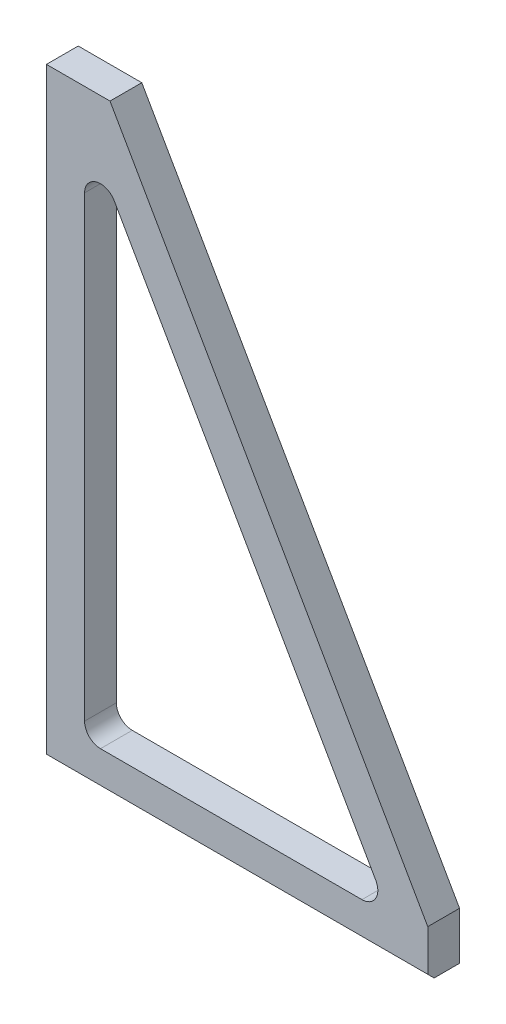
ISO-10303-21;
HEADER;
FILE_DESCRIPTION(('STEP AP214'),'2;1');
FILE_NAME('part.step','',(''),(''),'','','');
FILE_SCHEMA(('AUTOMOTIVE_DESIGN { 1 0 10303 214 1 1 1 1 }'));
ENDSEC;
DATA;
#1=APPLICATION_CONTEXT('core data for automotive mechanical design processes');
#2=APPLICATION_PROTOCOL_DEFINITION('international standard','automotive_design',2000,#1);
#3=PRODUCT_CONTEXT('',#1,'mechanical');
#4=PRODUCT('Part','Part','',(#3));
#5=PRODUCT_RELATED_PRODUCT_CATEGORY('part','',(#4));
#6=PRODUCT_DEFINITION_FORMATION('','',#4);
#7=PRODUCT_DEFINITION_CONTEXT('part definition',#1,'design');
#8=PRODUCT_DEFINITION('design','',#6,#7);
#9=PRODUCT_DEFINITION_SHAPE('','',#8);
#10=(LENGTH_UNIT() NAMED_UNIT(*) SI_UNIT(.MILLI.,.METRE.));
#11=(NAMED_UNIT(*) PLANE_ANGLE_UNIT() SI_UNIT($,.RADIAN.));
#12=(NAMED_UNIT(*) SI_UNIT($,.STERADIAN.) SOLID_ANGLE_UNIT());
#13=UNCERTAINTY_MEASURE_WITH_UNIT(LENGTH_MEASURE(1.E-05),#10,'distance_accuracy_value','');
#14=(GEOMETRIC_REPRESENTATION_CONTEXT(3) GLOBAL_UNCERTAINTY_ASSIGNED_CONTEXT((#13)) GLOBAL_UNIT_ASSIGNED_CONTEXT((#10,
#11,#12)) REPRESENTATION_CONTEXT('',''));
#15=CARTESIAN_POINT('',(0.,0.,0.));
#16=DIRECTION('',(0.,0.,1.));
#17=DIRECTION('',(1.,0.,0.));
#18=AXIS2_PLACEMENT_3D('',#15,#16,#17);
#19=CARTESIAN_POINT('',(0.,241.3,12.7));
#20=DIRECTION('',(0.,0.,-1.));
#21=DIRECTION('',(-1.,0.,0.));
#22=AXIS2_PLACEMENT_3D('',#19,#20,#21);
#23=PLANE('',#22);
#24=DIRECTION('',(0.,-1.,0.));
#25=VECTOR('',#24,1.);
#26=CARTESIAN_POINT('',(0.,0.,12.7));
#27=LINE('',#26,#25);
#28=CARTESIAN_POINT('',(0.,241.3,12.7));
#29=VERTEX_POINT('',#28);
#30=CARTESIAN_POINT('',(0.,2.54000000000001,12.7));
#31=VERTEX_POINT('',#30);
#32=EDGE_CURVE('E181',#29,#31,#27,.T.);
#33=ORIENTED_EDGE('',*,*,#32,.T.);
#34=DIRECTION('',(1.,0.,0.));
#35=VECTOR('',#34,1.);
#36=CARTESIAN_POINT('',(0.,2.54000000000001,12.7));
#37=LINE('',#36,#35);
#38=CARTESIAN_POINT('',(152.4,2.54000000000001,12.7));
#39=VERTEX_POINT('',#38);
#40=EDGE_CURVE('E214',#31,#39,#37,.T.);
#41=ORIENTED_EDGE('',*,*,#40,.T.);
#42=DIRECTION('',(0.,1.,0.));
#43=VECTOR('',#42,1.);
#44=CARTESIAN_POINT('',(152.4,0.,12.7));
#45=LINE('',#44,#43);
#46=CARTESIAN_POINT('',(152.4,19.05,12.7));
#47=VERTEX_POINT('',#46);
#48=EDGE_CURVE('E184',#39,#47,#45,.T.);
#49=ORIENTED_EDGE('',*,*,#48,.T.);
#50=DIRECTION('',(-0.496138938356834,0.868243142124459,0.));
#51=VECTOR('',#50,1.);
#52=CARTESIAN_POINT('',(25.4,241.3,12.7));
#53=LINE('',#52,#51);
#54=CARTESIAN_POINT('',(25.4,241.3,12.7));
#55=VERTEX_POINT('',#54);
#56=EDGE_CURVE('E187',#47,#55,#53,.T.);
#57=ORIENTED_EDGE('',*,*,#56,.T.);
#58=DIRECTION('',(-1.,0.,0.));
#59=VECTOR('',#58,1.);
#60=CARTESIAN_POINT('',(0.,241.3,12.7));
#61=LINE('',#60,#59);
#62=EDGE_CURVE('E189',#55,#29,#61,.T.);
#63=ORIENTED_EDGE('',*,*,#62,.T.);
#64=EDGE_LOOP('',(#33,#41,#49,#57,#63));
#65=FACE_BOUND('',#64,.T.);
#66=CARTESIAN_POINT('',(126.082265030605,21.59,12.7));
#67=DIRECTION('',(0.,0.,1.));
#68=DIRECTION('',(-1.,0.,0.));
#69=AXIS2_PLACEMENT_3D('',#66,#67,#68);
#70=CIRCLE('',#69,6.35);
#71=CARTESIAN_POINT('',(126.082265030605,15.24,12.7));
#72=VERTEX_POINT('',#71);
#73=CARTESIAN_POINT('',(131.595608983095,24.7404822585659,12.7));
#74=VERTEX_POINT('',#73);
#75=EDGE_CURVE('E125',#72,#74,#70,.T.);
#76=ORIENTED_EDGE('',*,*,#75,.F.);
#77=DIRECTION('',(1.,0.,0.));
#78=VECTOR('',#77,1.);
#79=CARTESIAN_POINT('',(21.59,15.24,12.7));
#80=LINE('',#79,#78);
#81=CARTESIAN_POINT('',(21.59,15.24,12.7));
#82=VERTEX_POINT('',#81);
#83=EDGE_CURVE('E157',#82,#72,#80,.T.);
#84=ORIENTED_EDGE('',*,*,#83,.F.);
#85=CARTESIAN_POINT('',(21.59,21.59,12.7));
#86=DIRECTION('',(0.,0.,1.));
#87=DIRECTION('',(1.,0.,0.));
#88=AXIS2_PLACEMENT_3D('',#85,#86,#87);
#89=CIRCLE('',#88,6.35);
#90=CARTESIAN_POINT('',(15.24,21.59,12.7));
#91=VERTEX_POINT('',#90);
#92=EDGE_CURVE('E154',#91,#82,#89,.T.);
#93=ORIENTED_EDGE('',*,*,#92,.F.);
#94=DIRECTION('',(0.,-1.,0.));
#95=VECTOR('',#94,1.);
#96=CARTESIAN_POINT('',(15.24,21.59,12.7));
#97=LINE('',#96,#95);
#98=CARTESIAN_POINT('',(15.24,204.451463803559,12.7));
#99=VERTEX_POINT('',#98);
#100=EDGE_CURVE('E150',#99,#91,#97,.T.);
#101=ORIENTED_EDGE('',*,*,#100,.F.);
#102=CARTESIAN_POINT('',(21.59,204.451463803559,12.7));
#103=DIRECTION('',(0.,0.,1.));
#104=DIRECTION('',(-1.,0.,0.));
#105=AXIS2_PLACEMENT_3D('',#102,#103,#104);
#106=CIRCLE('',#105,6.35000000000001);
#107=CARTESIAN_POINT('',(27.1033439524903,207.601946062124,12.7));
#108=VERTEX_POINT('',#107);
#109=EDGE_CURVE('E148',#108,#99,#106,.T.);
#110=ORIENTED_EDGE('',*,*,#109,.F.);
#111=DIRECTION('',(-0.496138938356834,0.868243142124459,0.));
#112=VECTOR('',#111,1.);
#113=CARTESIAN_POINT('',(27.1033439524903,207.601946062124,12.7));
#114=LINE('',#113,#112);
#115=EDGE_CURVE('E135',#74,#108,#114,.T.);
#116=ORIENTED_EDGE('',*,*,#115,.F.);
#117=EDGE_LOOP('',(#76,#84,#93,#101,#110,#116));
#118=FACE_BOUND('',#117,.T.);
#119=ADVANCED_FACE('F37',(#65,#118),#23,.F.);
#120=CARTESIAN_POINT('',(0.,241.3,0.));
#121=DIRECTION('',(0.,0.,-1.));
#122=DIRECTION('',(-1.,0.,0.));
#123=AXIS2_PLACEMENT_3D('',#120,#121,#122);
#124=PLANE('',#123);
#125=DIRECTION('',(0.,-1.,0.));
#126=VECTOR('',#125,1.);
#127=CARTESIAN_POINT('',(0.,0.,0.));
#128=LINE('',#127,#126);
#129=CARTESIAN_POINT('',(0.,241.3,0.));
#130=VERTEX_POINT('',#129);
#131=CARTESIAN_POINT('',(0.,0.,0.));
#132=VERTEX_POINT('',#131);
#133=EDGE_CURVE('E143',#130,#132,#128,.T.);
#134=ORIENTED_EDGE('',*,*,#133,.F.);
#135=DIRECTION('',(-1.,0.,0.));
#136=VECTOR('',#135,1.);
#137=CARTESIAN_POINT('',(0.,241.3,0.));
#138=LINE('',#137,#136);
#139=CARTESIAN_POINT('',(25.4,241.3,0.));
#140=VERTEX_POINT('',#139);
#141=EDGE_CURVE('E185',#140,#130,#138,.T.);
#142=ORIENTED_EDGE('',*,*,#141,.F.);
#143=DIRECTION('',(-0.496138938356834,0.868243142124459,0.));
#144=VECTOR('',#143,1.);
#145=CARTESIAN_POINT('',(25.4,241.3,0.));
#146=LINE('',#145,#144);
#147=CARTESIAN_POINT('',(152.4,19.05,0.));
#148=VERTEX_POINT('',#147);
#149=EDGE_CURVE('E199',#148,#140,#146,.T.);
#150=ORIENTED_EDGE('',*,*,#149,.F.);
#151=DIRECTION('',(0.,1.,0.));
#152=VECTOR('',#151,1.);
#153=CARTESIAN_POINT('',(152.4,0.,0.));
#154=LINE('',#153,#152);
#155=CARTESIAN_POINT('',(152.4,0.,0.));
#156=VERTEX_POINT('',#155);
#157=EDGE_CURVE('E197',#156,#148,#154,.T.);
#158=ORIENTED_EDGE('',*,*,#157,.F.);
#159=DIRECTION('',(1.,0.,0.));
#160=VECTOR('',#159,1.);
#161=CARTESIAN_POINT('',(0.,0.,0.));
#162=LINE('',#161,#160);
#163=EDGE_CURVE('E194',#132,#156,#162,.T.);
#164=ORIENTED_EDGE('',*,*,#163,.F.);
#165=EDGE_LOOP('',(#134,#142,#150,#158,#164));
#166=FACE_BOUND('',#165,.T.);
#167=DIRECTION('',(1.,0.,0.));
#168=VECTOR('',#167,1.);
#169=CARTESIAN_POINT('',(21.59,15.24,0.));
#170=LINE('',#169,#168);
#171=CARTESIAN_POINT('',(21.59,15.24,0.));
#172=VERTEX_POINT('',#171);
#173=CARTESIAN_POINT('',(126.082265030605,15.24,0.));
#174=VERTEX_POINT('',#173);
#175=EDGE_CURVE('E136',#172,#174,#170,.T.);
#176=ORIENTED_EDGE('',*,*,#175,.T.);
#177=CARTESIAN_POINT('',(126.082265030605,21.59,0.));
#178=DIRECTION('',(0.,0.,1.));
#179=DIRECTION('',(-1.,0.,0.));
#180=AXIS2_PLACEMENT_3D('',#177,#178,#179);
#181=CIRCLE('',#180,6.35);
#182=CARTESIAN_POINT('',(131.595608983095,24.7404822585659,0.));
#183=VERTEX_POINT('',#182);
#184=EDGE_CURVE('E159',#174,#183,#181,.T.);
#185=ORIENTED_EDGE('',*,*,#184,.T.);
#186=DIRECTION('',(-0.496138938356834,0.868243142124459,0.));
#187=VECTOR('',#186,1.);
#188=CARTESIAN_POINT('',(27.1033439524903,207.601946062124,0.));
#189=LINE('',#188,#187);
#190=CARTESIAN_POINT('',(27.1033439524903,207.601946062124,0.));
#191=VERTEX_POINT('',#190);
#192=EDGE_CURVE('E142',#183,#191,#189,.T.);
#193=ORIENTED_EDGE('',*,*,#192,.T.);
#194=CARTESIAN_POINT('',(21.59,204.451463803559,0.));
#195=DIRECTION('',(0.,0.,1.));
#196=DIRECTION('',(-1.,0.,0.));
#197=AXIS2_PLACEMENT_3D('',#194,#195,#196);
#198=CIRCLE('',#197,6.35000000000001);
#199=CARTESIAN_POINT('',(15.24,204.451463803559,0.));
#200=VERTEX_POINT('',#199);
#201=EDGE_CURVE('E162',#191,#200,#198,.T.);
#202=ORIENTED_EDGE('',*,*,#201,.T.);
#203=DIRECTION('',(0.,-1.,0.));
#204=VECTOR('',#203,1.);
#205=CARTESIAN_POINT('',(15.24,21.59,0.));
#206=LINE('',#205,#204);
#207=CARTESIAN_POINT('',(15.24,21.59,0.));
#208=VERTEX_POINT('',#207);
#209=EDGE_CURVE('E165',#200,#208,#206,.T.);
#210=ORIENTED_EDGE('',*,*,#209,.T.);
#211=CARTESIAN_POINT('',(21.59,21.59,0.));
#212=DIRECTION('',(0.,0.,1.));
#213=DIRECTION('',(1.,0.,0.));
#214=AXIS2_PLACEMENT_3D('',#211,#212,#213);
#215=CIRCLE('',#214,6.35);
#216=EDGE_CURVE('E168',#208,#172,#215,.T.);
#217=ORIENTED_EDGE('',*,*,#216,.T.);
#218=EDGE_LOOP('',(#176,#185,#193,#202,#210,#217));
#219=FACE_BOUND('',#218,.T.);
#220=ADVANCED_FACE('F247',(#166,#219),#124,.T.);
#221=CARTESIAN_POINT('',(0.,0.,12.7));
#222=DIRECTION('',(1.,0.,0.));
#223=DIRECTION('',(0.,0.,-1.));
#224=AXIS2_PLACEMENT_3D('',#221,#222,#223);
#225=PLANE('',#224);
#226=DIRECTION('',(0.,0.,-1.));
#227=VECTOR('',#226,1.);
#228=CARTESIAN_POINT('',(0.,0.,12.7));
#229=LINE('',#228,#227);
#230=CARTESIAN_POINT('',(0.,0.,10.16));
#231=VERTEX_POINT('',#230);
#232=EDGE_CURVE('E212',#231,#132,#229,.T.);
#233=ORIENTED_EDGE('',*,*,#232,.F.);
#234=DIRECTION('',(0.,-0.707106781186548,-0.707106781186547));
#235=VECTOR('',#234,1.);
#236=CARTESIAN_POINT('',(0.,2.54000000000001,12.7));
#237=LINE('',#236,#235);
#238=EDGE_CURVE('E11',#231,#31,#237,.F.);
#239=ORIENTED_EDGE('',*,*,#238,.T.);
#240=ORIENTED_EDGE('',*,*,#32,.F.);
#241=DIRECTION('',(0.,0.,-1.));
#242=VECTOR('',#241,1.);
#243=CARTESIAN_POINT('',(0.,241.3,12.7));
#244=LINE('',#243,#242);
#245=EDGE_CURVE('E191',#29,#130,#244,.T.);
#246=ORIENTED_EDGE('',*,*,#245,.T.);
#247=ORIENTED_EDGE('',*,*,#133,.T.);
#248=EDGE_LOOP('',(#233,#239,#240,#246,#247));
#249=FACE_BOUND('',#248,.T.);
#250=ADVANCED_FACE('F237',(#249),#225,.F.);
#251=CARTESIAN_POINT('',(0.,0.,12.7));
#252=DIRECTION('',(0.,1.,0.));
#253=DIRECTION('',(0.,0.,1.));
#254=AXIS2_PLACEMENT_3D('',#251,#252,#253);
#255=PLANE('',#254);
#256=DIRECTION('',(0.,0.,-1.));
#257=VECTOR('',#256,1.);
#258=CARTESIAN_POINT('',(152.4,0.,12.7));
#259=LINE('',#258,#257);
#260=CARTESIAN_POINT('',(152.4,0.,10.16));
#261=VERTEX_POINT('',#260);
#262=EDGE_CURVE('E210',#261,#156,#259,.T.);
#263=ORIENTED_EDGE('',*,*,#262,.F.);
#264=DIRECTION('',(-1.,0.,0.));
#265=VECTOR('',#264,1.);
#266=CARTESIAN_POINT('',(0.,0.,10.16));
#267=LINE('',#266,#265);
#268=EDGE_CURVE('E45',#261,#231,#267,.T.);
#269=ORIENTED_EDGE('',*,*,#268,.T.);
#270=ORIENTED_EDGE('',*,*,#232,.T.);
#271=ORIENTED_EDGE('',*,*,#163,.T.);
#272=EDGE_LOOP('',(#263,#269,#270,#271));
#273=FACE_BOUND('',#272,.T.);
#274=ADVANCED_FACE('F263',(#273),#255,.F.);
#275=CARTESIAN_POINT('',(152.4,0.,12.7));
#276=DIRECTION('',(-1.,0.,0.));
#277=DIRECTION('',(0.,0.,1.));
#278=AXIS2_PLACEMENT_3D('',#275,#276,#277);
#279=PLANE('',#278);
#280=ORIENTED_EDGE('',*,*,#48,.F.);
#281=DIRECTION('',(0.,0.707106781186548,0.707106781186547));
#282=VECTOR('',#281,1.);
#283=CARTESIAN_POINT('',(152.4,2.54000000000001,12.7));
#284=LINE('',#283,#282);
#285=EDGE_CURVE('E59',#39,#261,#284,.F.);
#286=ORIENTED_EDGE('',*,*,#285,.T.);
#287=ORIENTED_EDGE('',*,*,#262,.T.);
#288=ORIENTED_EDGE('',*,*,#157,.T.);
#289=DIRECTION('',(0.,0.,-1.));
#290=VECTOR('',#289,1.);
#291=CARTESIAN_POINT('',(152.4,19.05,12.7));
#292=LINE('',#291,#290);
#293=EDGE_CURVE('E207',#47,#148,#292,.T.);
#294=ORIENTED_EDGE('',*,*,#293,.F.);
#295=EDGE_LOOP('',(#280,#286,#287,#288,#294));
#296=FACE_BOUND('',#295,.T.);
#297=ADVANCED_FACE('F223',(#296),#279,.F.);
#298=CARTESIAN_POINT('',(25.4,241.3,12.7));
#299=DIRECTION('',(-0.868243142124459,-0.496138938356834,0.));
#300=DIRECTION('',(0.496138938356834,-0.868243142124459,0.));
#301=AXIS2_PLACEMENT_3D('',#298,#299,#300);
#302=PLANE('',#301);
#303=ORIENTED_EDGE('',*,*,#149,.T.);
#304=DIRECTION('',(0.,0.,-1.));
#305=VECTOR('',#304,1.);
#306=CARTESIAN_POINT('',(25.4,241.3,12.7));
#307=LINE('',#306,#305);
#308=EDGE_CURVE('E204',#55,#140,#307,.T.);
#309=ORIENTED_EDGE('',*,*,#308,.F.);
#310=ORIENTED_EDGE('',*,*,#56,.F.);
#311=ORIENTED_EDGE('',*,*,#293,.T.);
#312=EDGE_LOOP('',(#303,#309,#310,#311));
#313=FACE_BOUND('',#312,.T.);
#314=ADVANCED_FACE('F229',(#313),#302,.F.);
#315=CARTESIAN_POINT('',(0.,241.3,12.7));
#316=DIRECTION('',(0.,-1.,0.));
#317=DIRECTION('',(0.,0.,-1.));
#318=AXIS2_PLACEMENT_3D('',#315,#316,#317);
#319=PLANE('',#318);
#320=ORIENTED_EDGE('',*,*,#141,.T.);
#321=ORIENTED_EDGE('',*,*,#245,.F.);
#322=ORIENTED_EDGE('',*,*,#62,.F.);
#323=ORIENTED_EDGE('',*,*,#308,.T.);
#324=EDGE_LOOP('',(#320,#321,#322,#323));
#325=FACE_BOUND('',#324,.T.);
#326=ADVANCED_FACE('F233',(#325),#319,.F.);
#327=CARTESIAN_POINT('',(126.082265030605,21.59,12.7));
#328=DIRECTION('',(0.,0.,-1.));
#329=DIRECTION('',(-1.,0.,0.));
#330=AXIS2_PLACEMENT_3D('',#327,#328,#329);
#331=CYLINDRICAL_SURFACE('',#330,6.35);
#332=ORIENTED_EDGE('',*,*,#184,.F.);
#333=DIRECTION('',(0.,0.,-1.));
#334=VECTOR('',#333,1.);
#335=CARTESIAN_POINT('',(126.082265030605,15.24,12.7));
#336=LINE('',#335,#334);
#337=EDGE_CURVE('E131',#72,#174,#336,.T.);
#338=ORIENTED_EDGE('',*,*,#337,.F.);
#339=ORIENTED_EDGE('',*,*,#75,.T.);
#340=DIRECTION('',(0.,0.,-1.));
#341=VECTOR('',#340,1.);
#342=CARTESIAN_POINT('',(131.595608983095,24.7404822585659,12.7));
#343=LINE('',#342,#341);
#344=EDGE_CURVE('E128',#74,#183,#343,.T.);
#345=ORIENTED_EDGE('',*,*,#344,.T.);
#346=EDGE_LOOP('',(#332,#338,#339,#345));
#347=FACE_BOUND('',#346,.T.);
#348=ADVANCED_FACE('F127',(#347),#331,.F.);
#349=CARTESIAN_POINT('',(27.1033439524903,207.601946062124,12.7));
#350=DIRECTION('',(-0.868243142124459,-0.496138938356834,0.));
#351=DIRECTION('',(0.496138938356834,-0.868243142124459,0.));
#352=AXIS2_PLACEMENT_3D('',#349,#350,#351);
#353=PLANE('',#352);
#354=ORIENTED_EDGE('',*,*,#192,.F.);
#355=ORIENTED_EDGE('',*,*,#344,.F.);
#356=ORIENTED_EDGE('',*,*,#115,.T.);
#357=DIRECTION('',(0.,0.,-1.));
#358=VECTOR('',#357,1.);
#359=CARTESIAN_POINT('',(27.1033439524903,207.601946062124,12.7));
#360=LINE('',#359,#358);
#361=EDGE_CURVE('E144',#108,#191,#360,.T.);
#362=ORIENTED_EDGE('',*,*,#361,.T.);
#363=EDGE_LOOP('',(#354,#355,#356,#362));
#364=FACE_BOUND('',#363,.T.);
#365=ADVANCED_FACE('F139',(#364),#353,.T.);
#366=CARTESIAN_POINT('',(21.59,204.451463803559,12.7));
#367=DIRECTION('',(0.,0.,-1.));
#368=DIRECTION('',(-1.,0.,0.));
#369=AXIS2_PLACEMENT_3D('',#366,#367,#368);
#370=CYLINDRICAL_SURFACE('',#369,6.35000000000001);
#371=ORIENTED_EDGE('',*,*,#201,.F.);
#372=ORIENTED_EDGE('',*,*,#361,.F.);
#373=ORIENTED_EDGE('',*,*,#109,.T.);
#374=DIRECTION('',(0.,0.,-1.));
#375=VECTOR('',#374,1.);
#376=CARTESIAN_POINT('',(15.24,204.451463803559,12.7));
#377=LINE('',#376,#375);
#378=EDGE_CURVE('E178',#99,#200,#377,.T.);
#379=ORIENTED_EDGE('',*,*,#378,.T.);
#380=EDGE_LOOP('',(#371,#372,#373,#379));
#381=FACE_BOUND('',#380,.T.);
#382=ADVANCED_FACE('F297',(#381),#370,.F.);
#383=CARTESIAN_POINT('',(15.24,21.59,12.7));
#384=DIRECTION('',(1.,0.,0.));
#385=DIRECTION('',(0.,0.,-1.));
#386=AXIS2_PLACEMENT_3D('',#383,#384,#385);
#387=PLANE('',#386);
#388=ORIENTED_EDGE('',*,*,#209,.F.);
#389=ORIENTED_EDGE('',*,*,#378,.F.);
#390=ORIENTED_EDGE('',*,*,#100,.T.);
#391=DIRECTION('',(0.,0.,-1.));
#392=VECTOR('',#391,1.);
#393=CARTESIAN_POINT('',(15.24,21.59,12.7));
#394=LINE('',#393,#392);
#395=EDGE_CURVE('E176',#91,#208,#394,.T.);
#396=ORIENTED_EDGE('',*,*,#395,.T.);
#397=EDGE_LOOP('',(#388,#389,#390,#396));
#398=FACE_BOUND('',#397,.T.);
#399=ADVANCED_FACE('F303',(#398),#387,.T.);
#400=CARTESIAN_POINT('',(21.59,21.59,12.7));
#401=DIRECTION('',(0.,0.,-1.));
#402=DIRECTION('',(-1.,0.,0.));
#403=AXIS2_PLACEMENT_3D('',#400,#401,#402);
#404=CYLINDRICAL_SURFACE('',#403,6.35);
#405=ORIENTED_EDGE('',*,*,#216,.F.);
#406=ORIENTED_EDGE('',*,*,#395,.F.);
#407=ORIENTED_EDGE('',*,*,#92,.T.);
#408=DIRECTION('',(0.,0.,-1.));
#409=VECTOR('',#408,1.);
#410=CARTESIAN_POINT('',(21.59,15.24,12.7));
#411=LINE('',#410,#409);
#412=EDGE_CURVE('E174',#82,#172,#411,.T.);
#413=ORIENTED_EDGE('',*,*,#412,.T.);
#414=EDGE_LOOP('',(#405,#406,#407,#413));
#415=FACE_BOUND('',#414,.T.);
#416=ADVANCED_FACE('F243',(#415),#404,.F.);
#417=CARTESIAN_POINT('',(21.59,15.24,12.7));
#418=DIRECTION('',(0.,1.,0.));
#419=DIRECTION('',(0.,0.,1.));
#420=AXIS2_PLACEMENT_3D('',#417,#418,#419);
#421=PLANE('',#420);
#422=ORIENTED_EDGE('',*,*,#175,.F.);
#423=ORIENTED_EDGE('',*,*,#412,.F.);
#424=ORIENTED_EDGE('',*,*,#83,.T.);
#425=ORIENTED_EDGE('',*,*,#337,.T.);
#426=EDGE_LOOP('',(#422,#423,#424,#425));
#427=FACE_BOUND('',#426,.T.);
#428=ADVANCED_FACE('F239',(#427),#421,.T.);
#429=CARTESIAN_POINT('',(0.,2.54000000000001,12.7));
#430=DIRECTION('',(0.,0.707106781186547,-0.707106781186548));
#431=DIRECTION('',(0.,0.707106781186548,0.707106781186547));
#432=AXIS2_PLACEMENT_3D('',#429,#430,#431);
#433=PLANE('',#432);
#434=ORIENTED_EDGE('',*,*,#238,.F.);
#435=ORIENTED_EDGE('',*,*,#268,.F.);
#436=ORIENTED_EDGE('',*,*,#285,.F.);
#437=ORIENTED_EDGE('',*,*,#40,.F.);
#438=EDGE_LOOP('',(#434,#435,#436,#437));
#439=FACE_BOUND('',#438,.T.);
#440=ADVANCED_FACE('F39',(#439),#433,.F.);
#441=CLOSED_SHELL('',(#119,#220,#250,#274,#297,#314,#326,#348,#365,#382,#399,#416,#428,#440));
#442=MANIFOLD_SOLID_BREP('B2',#441);
#443=ADVANCED_BREP_SHAPE_REPRESENTATION('',(#18,#442),#14);
#444=SHAPE_DEFINITION_REPRESENTATION(#9,#443);
ENDSEC;
END-ISO-10303-21;
